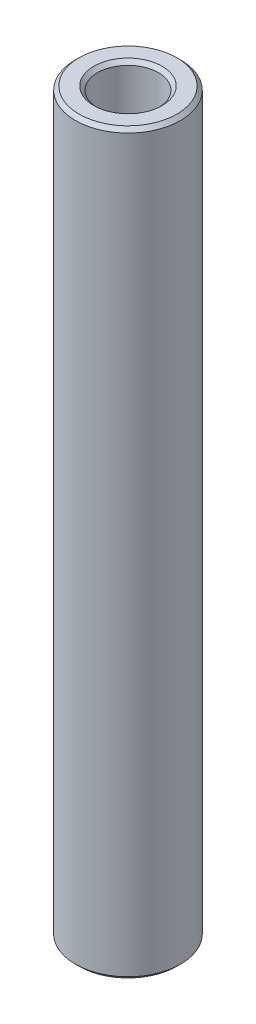
ISO-10303-21;
HEADER;
FILE_DESCRIPTION(('STEP AP214'),'2;1');
FILE_NAME('part.step','',(''),(''),'','','');
FILE_SCHEMA(('AUTOMOTIVE_DESIGN { 1 0 10303 214 1 1 1 1 }'));
ENDSEC;
DATA;
#1=APPLICATION_CONTEXT('core data for automotive mechanical design processes');
#2=APPLICATION_PROTOCOL_DEFINITION('international standard','automotive_design',2000,#1);
#3=PRODUCT_CONTEXT('',#1,'mechanical');
#4=PRODUCT('Part','Part','',(#3));
#5=PRODUCT_RELATED_PRODUCT_CATEGORY('part','',(#4));
#6=PRODUCT_DEFINITION_FORMATION('','',#4);
#7=PRODUCT_DEFINITION_CONTEXT('part definition',#1,'design');
#8=PRODUCT_DEFINITION('design','',#6,#7);
#9=PRODUCT_DEFINITION_SHAPE('','',#8);
#10=(LENGTH_UNIT() NAMED_UNIT(*) SI_UNIT(.MILLI.,.METRE.));
#11=(NAMED_UNIT(*) PLANE_ANGLE_UNIT() SI_UNIT($,.RADIAN.));
#12=(NAMED_UNIT(*) SI_UNIT($,.STERADIAN.) SOLID_ANGLE_UNIT());
#13=UNCERTAINTY_MEASURE_WITH_UNIT(LENGTH_MEASURE(1.E-05),#10,'distance_accuracy_value','');
#14=(GEOMETRIC_REPRESENTATION_CONTEXT(3) GLOBAL_UNCERTAINTY_ASSIGNED_CONTEXT((#13)) GLOBAL_UNIT_ASSIGNED_CONTEXT((#10,
#11,#12)) REPRESENTATION_CONTEXT('',''));
#15=CARTESIAN_POINT('',(0.,0.,0.));
#16=DIRECTION('',(0.,0.,1.));
#17=DIRECTION('',(1.,0.,0.));
#18=AXIS2_PLACEMENT_3D('',#15,#16,#17);
#19=CARTESIAN_POINT('',(0.,40.,0.));
#20=DIRECTION('',(0.,1.,0.));
#21=DIRECTION('',(0.,0.,1.));
#22=AXIS2_PLACEMENT_3D('',#19,#20,#21);
#23=PLANE('',#22);
#24=CARTESIAN_POINT('',(0.,40.,0.));
#25=DIRECTION('',(0.,1.,0.));
#26=DIRECTION('',(0.,0.,1.));
#27=AXIS2_PLACEMENT_3D('',#24,#25,#26);
#28=CIRCLE('',#27,1.85);
#29=CARTESIAN_POINT('',(0.,40.,1.85));
#30=VERTEX_POINT('',#29);
#31=EDGE_CURVE('E10',#30,#30,#28,.F.);
#32=ORIENTED_EDGE('',*,*,#31,.T.);
#33=EDGE_LOOP('',(#32));
#34=FACE_BOUND('',#33,.T.);
#35=CARTESIAN_POINT('',(0.,40.,0.));
#36=DIRECTION('',(0.,1.,0.));
#37=DIRECTION('',(0.,0.,1.));
#38=AXIS2_PLACEMENT_3D('',#35,#36,#37);
#39=CIRCLE('',#38,2.65);
#40=CARTESIAN_POINT('',(0.,40.,2.65));
#41=VERTEX_POINT('',#40);
#42=EDGE_CURVE('E50',#41,#41,#39,.T.);
#43=ORIENTED_EDGE('',*,*,#42,.T.);
#44=EDGE_LOOP('',(#43));
#45=FACE_BOUND('',#44,.T.);
#46=ADVANCED_FACE('F41',(#34,#45),#23,.T.);
#47=CARTESIAN_POINT('',(0.,0.,0.));
#48=DIRECTION('',(0.,1.,0.));
#49=DIRECTION('',(0.,0.,1.));
#50=AXIS2_PLACEMENT_3D('',#47,#48,#49);
#51=PLANE('',#50);
#52=CARTESIAN_POINT('',(0.,0.,0.));
#53=DIRECTION('',(0.,1.,0.));
#54=DIRECTION('',(0.,0.,1.));
#55=AXIS2_PLACEMENT_3D('',#52,#53,#54);
#56=CIRCLE('',#55,1.85);
#57=CARTESIAN_POINT('',(0.,0.,1.85));
#58=VERTEX_POINT('',#57);
#59=EDGE_CURVE('E74',#58,#58,#56,.T.);
#60=ORIENTED_EDGE('',*,*,#59,.T.);
#61=EDGE_LOOP('',(#60));
#62=FACE_BOUND('',#61,.T.);
#63=CARTESIAN_POINT('',(0.,0.,0.));
#64=DIRECTION('',(0.,1.,0.));
#65=DIRECTION('',(0.,0.,1.));
#66=AXIS2_PLACEMENT_3D('',#63,#64,#65);
#67=CIRCLE('',#66,2.65000000000001);
#68=CARTESIAN_POINT('',(0.,0.,2.65000000000001));
#69=VERTEX_POINT('',#68);
#70=EDGE_CURVE('E78',#69,#69,#67,.F.);
#71=ORIENTED_EDGE('',*,*,#70,.T.);
#72=EDGE_LOOP('',(#71));
#73=FACE_BOUND('',#72,.T.);
#74=ADVANCED_FACE('F83',(#62,#73),#51,.F.);
#75=CARTESIAN_POINT('',(0.,40.,0.));
#76=DIRECTION('',(0.,-1.,0.));
#77=DIRECTION('',(0.,0.,-1.));
#78=AXIS2_PLACEMENT_3D('',#75,#76,#77);
#79=CYLINDRICAL_SURFACE('',#78,2.85);
#80=CARTESIAN_POINT('',(0.,0.199999999999992,0.));
#81=DIRECTION('',(0.,1.,0.));
#82=DIRECTION('',(0.,0.,1.));
#83=AXIS2_PLACEMENT_3D('',#80,#81,#82);
#84=CIRCLE('',#83,2.85);
#85=CARTESIAN_POINT('',(0.,0.199999999999992,2.85));
#86=VERTEX_POINT('',#85);
#87=EDGE_CURVE('E55',#86,#86,#84,.T.);
#88=ORIENTED_EDGE('',*,*,#87,.T.);
#89=EDGE_LOOP('',(#88));
#90=FACE_BOUND('',#89,.T.);
#91=CARTESIAN_POINT('',(0.,39.8,0.));
#92=DIRECTION('',(0.,1.,0.));
#93=DIRECTION('',(0.,0.,1.));
#94=AXIS2_PLACEMENT_3D('',#91,#92,#93);
#95=CIRCLE('',#94,2.85);
#96=CARTESIAN_POINT('',(0.,39.8,2.85));
#97=VERTEX_POINT('',#96);
#98=EDGE_CURVE('E60',#97,#97,#95,.F.);
#99=ORIENTED_EDGE('',*,*,#98,.T.);
#100=EDGE_LOOP('',(#99));
#101=FACE_BOUND('',#100,.T.);
#102=ADVANCED_FACE('F93',(#90,#101),#79,.T.);
#103=CARTESIAN_POINT('',(0.,40.,0.));
#104=DIRECTION('',(0.,-1.,0.));
#105=DIRECTION('',(0.,0.,-1.));
#106=AXIS2_PLACEMENT_3D('',#103,#104,#105);
#107=CYLINDRICAL_SURFACE('',#106,1.65);
#108=CARTESIAN_POINT('',(0.,0.199999999999999,0.));
#109=DIRECTION('',(0.,1.,0.));
#110=DIRECTION('',(0.,0.,1.));
#111=AXIS2_PLACEMENT_3D('',#108,#109,#110);
#112=CIRCLE('',#111,1.65);
#113=CARTESIAN_POINT('',(0.,0.199999999999999,1.65));
#114=VERTEX_POINT('',#113);
#115=EDGE_CURVE('E66',#114,#114,#112,.F.);
#116=ORIENTED_EDGE('',*,*,#115,.T.);
#117=EDGE_LOOP('',(#116));
#118=FACE_BOUND('',#117,.T.);
#119=CARTESIAN_POINT('',(0.,39.8,0.));
#120=DIRECTION('',(0.,1.,0.));
#121=DIRECTION('',(0.,0.,1.));
#122=AXIS2_PLACEMENT_3D('',#119,#120,#121);
#123=CIRCLE('',#122,1.65);
#124=CARTESIAN_POINT('',(0.,39.8,1.65));
#125=VERTEX_POINT('',#124);
#126=EDGE_CURVE('E70',#125,#125,#123,.T.);
#127=ORIENTED_EDGE('',*,*,#126,.T.);
#128=EDGE_LOOP('',(#127));
#129=FACE_BOUND('',#128,.T.);
#130=ADVANCED_FACE('F96',(#118,#129),#107,.F.);
#131=CARTESIAN_POINT('',(0.,0.,0.));
#132=DIRECTION('',(0.,-1.,0.));
#133=DIRECTION('',(0.,0.,-1.));
#134=AXIS2_PLACEMENT_3D('',#131,#132,#133);
#135=CONICAL_SURFACE('',#134,1.85,0.785398163397445);
#136=ORIENTED_EDGE('',*,*,#115,.F.);
#137=EDGE_LOOP('',(#136));
#138=FACE_BOUND('',#137,.T.);
#139=ORIENTED_EDGE('',*,*,#59,.F.);
#140=EDGE_LOOP('',(#139));
#141=FACE_BOUND('',#140,.T.);
#142=ADVANCED_FACE('F89',(#138,#141),#135,.F.);
#143=CARTESIAN_POINT('',(0.,0.199999999999992,0.));
#144=DIRECTION('',(0.,1.,0.));
#145=DIRECTION('',(0.,0.,1.));
#146=AXIS2_PLACEMENT_3D('',#143,#144,#145);
#147=CONICAL_SURFACE('',#146,2.85,0.785398163397452);
#148=ORIENTED_EDGE('',*,*,#70,.F.);
#149=EDGE_LOOP('',(#148));
#150=FACE_BOUND('',#149,.T.);
#151=ORIENTED_EDGE('',*,*,#87,.F.);
#152=EDGE_LOOP('',(#151));
#153=FACE_BOUND('',#152,.T.);
#154=ADVANCED_FACE('F85',(#150,#153),#147,.T.);
#155=CARTESIAN_POINT('',(0.,39.8,0.));
#156=DIRECTION('',(0.,1.,0.));
#157=DIRECTION('',(0.,0.,1.));
#158=AXIS2_PLACEMENT_3D('',#155,#156,#157);
#159=CONICAL_SURFACE('',#158,1.65,0.785398163397445);
#160=ORIENTED_EDGE('',*,*,#31,.F.);
#161=EDGE_LOOP('',(#160));
#162=FACE_BOUND('',#161,.T.);
#163=ORIENTED_EDGE('',*,*,#126,.F.);
#164=EDGE_LOOP('',(#163));
#165=FACE_BOUND('',#164,.T.);
#166=ADVANCED_FACE('F88',(#162,#165),#159,.F.);
#167=CARTESIAN_POINT('',(0.,40.,0.));
#168=DIRECTION('',(0.,-1.,0.));
#169=DIRECTION('',(0.,0.,-1.));
#170=AXIS2_PLACEMENT_3D('',#167,#168,#169);
#171=CONICAL_SURFACE('',#170,2.65,0.785398163397479);
#172=ORIENTED_EDGE('',*,*,#98,.F.);
#173=EDGE_LOOP('',(#172));
#174=FACE_BOUND('',#173,.T.);
#175=ORIENTED_EDGE('',*,*,#42,.F.);
#176=EDGE_LOOP('',(#175));
#177=FACE_BOUND('',#176,.T.);
#178=ADVANCED_FACE('F44',(#174,#177),#171,.T.);
#179=CLOSED_SHELL('',(#46,#74,#102,#130,#142,#154,#166,#178));
#180=MANIFOLD_SOLID_BREP('B2',#179);
#181=ADVANCED_BREP_SHAPE_REPRESENTATION('',(#18,#180),#14);
#182=SHAPE_DEFINITION_REPRESENTATION(#9,#181);
ENDSEC;
END-ISO-10303-21;
